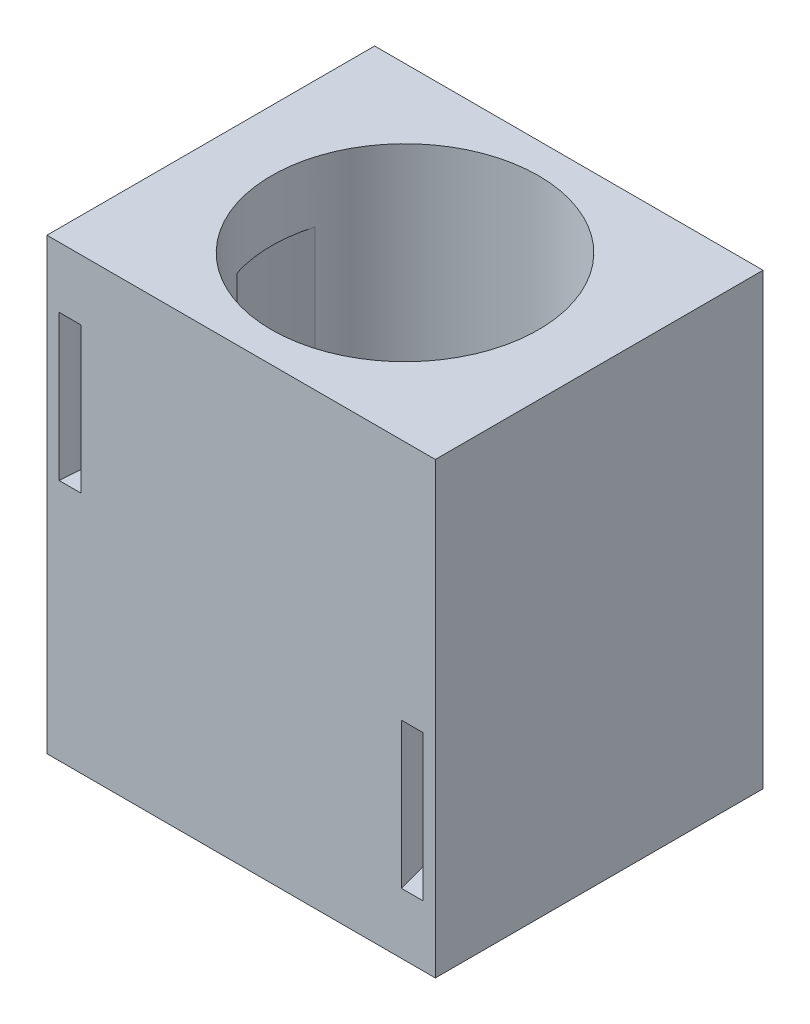
ISO-10303-21;
HEADER;
FILE_DESCRIPTION(('STEP AP214'),'2;1');
FILE_NAME('part.step','',(''),(''),'','','');
FILE_SCHEMA(('AUTOMOTIVE_DESIGN { 1 0 10303 214 1 1 1 1 }'));
ENDSEC;
DATA;
#1=APPLICATION_CONTEXT('core data for automotive mechanical design processes');
#2=APPLICATION_PROTOCOL_DEFINITION('international standard','automotive_design',2000,#1);
#3=PRODUCT_CONTEXT('',#1,'mechanical');
#4=PRODUCT('Part','Part','',(#3));
#5=PRODUCT_RELATED_PRODUCT_CATEGORY('part','',(#4));
#6=PRODUCT_DEFINITION_FORMATION('','',#4);
#7=PRODUCT_DEFINITION_CONTEXT('part definition',#1,'design');
#8=PRODUCT_DEFINITION('design','',#6,#7);
#9=PRODUCT_DEFINITION_SHAPE('','',#8);
#10=(LENGTH_UNIT() NAMED_UNIT(*) SI_UNIT(.MILLI.,.METRE.));
#11=(NAMED_UNIT(*) PLANE_ANGLE_UNIT() SI_UNIT($,.RADIAN.));
#12=(NAMED_UNIT(*) SI_UNIT($,.STERADIAN.) SOLID_ANGLE_UNIT());
#13=UNCERTAINTY_MEASURE_WITH_UNIT(LENGTH_MEASURE(1.E-05),#10,'distance_accuracy_value','');
#14=(GEOMETRIC_REPRESENTATION_CONTEXT(3) GLOBAL_UNCERTAINTY_ASSIGNED_CONTEXT((#13)) GLOBAL_UNIT_ASSIGNED_CONTEXT((#10,
#11,#12)) REPRESENTATION_CONTEXT('',''));
#15=CARTESIAN_POINT('',(0.,0.,0.));
#16=DIRECTION('',(0.,0.,1.));
#17=DIRECTION('',(1.,0.,0.));
#18=AXIS2_PLACEMENT_3D('',#15,#16,#17);
#19=CARTESIAN_POINT('',(16.,30.,13.5));
#20=DIRECTION('',(0.,0.,-1.));
#21=DIRECTION('',(-1.,0.,0.));
#22=AXIS2_PLACEMENT_3D('',#19,#20,#21);
#23=PLANE('',#22);
#24=DIRECTION('',(1.,0.,0.));
#25=VECTOR('',#24,1.);
#26=CARTESIAN_POINT('',(-15.,16.5,13.5));
#27=LINE('',#26,#25);
#28=CARTESIAN_POINT('',(-15.,16.5,13.5));
#29=VERTEX_POINT('',#28);
#30=CARTESIAN_POINT('',(-13.2,16.5,13.5));
#31=VERTEX_POINT('',#30);
#32=EDGE_CURVE('E193',#29,#31,#27,.T.);
#33=ORIENTED_EDGE('',*,*,#32,.F.);
#34=DIRECTION('',(0.,1.,0.));
#35=VECTOR('',#34,1.);
#36=CARTESIAN_POINT('',(-15.,16.5,13.5));
#37=LINE('',#36,#35);
#38=CARTESIAN_POINT('',(-15.,28.5,13.5));
#39=VERTEX_POINT('',#38);
#40=EDGE_CURVE('E200',#29,#39,#37,.T.);
#41=ORIENTED_EDGE('',*,*,#40,.T.);
#42=DIRECTION('',(1.,0.,0.));
#43=VECTOR('',#42,1.);
#44=CARTESIAN_POINT('',(-15.,28.5,13.5));
#45=LINE('',#44,#43);
#46=CARTESIAN_POINT('',(-13.2,28.5,13.5));
#47=VERTEX_POINT('',#46);
#48=EDGE_CURVE('E203',#39,#47,#45,.T.);
#49=ORIENTED_EDGE('',*,*,#48,.T.);
#50=DIRECTION('',(0.,1.,0.));
#51=VECTOR('',#50,1.);
#52=CARTESIAN_POINT('',(-13.2,16.5,13.5));
#53=LINE('',#52,#51);
#54=EDGE_CURVE('E211',#31,#47,#53,.T.);
#55=ORIENTED_EDGE('',*,*,#54,.F.);
#56=EDGE_LOOP('',(#33,#41,#49,#55));
#57=FACE_BOUND('',#56,.T.);
#58=DIRECTION('',(0.,-1.,0.));
#59=VECTOR('',#58,1.);
#60=CARTESIAN_POINT('',(-16.,30.,13.5));
#61=LINE('',#60,#59);
#62=CARTESIAN_POINT('',(-16.,33.5,13.5));
#63=VERTEX_POINT('',#62);
#64=CARTESIAN_POINT('',(-16.,-3.5,13.5));
#65=VERTEX_POINT('',#64);
#66=EDGE_CURVE('E123',#63,#65,#61,.T.);
#67=ORIENTED_EDGE('',*,*,#66,.T.);
#68=DIRECTION('',(-1.,0.,0.));
#69=VECTOR('',#68,1.);
#70=CARTESIAN_POINT('',(16.,-3.5,13.5));
#71=LINE('',#70,#69);
#72=CARTESIAN_POINT('',(16.,-3.5,13.5));
#73=VERTEX_POINT('',#72);
#74=EDGE_CURVE('E127',#73,#65,#71,.T.);
#75=ORIENTED_EDGE('',*,*,#74,.F.);
#76=DIRECTION('',(0.,-1.,0.));
#77=VECTOR('',#76,1.);
#78=CARTESIAN_POINT('',(16.,30.,13.5));
#79=LINE('',#78,#77);
#80=CARTESIAN_POINT('',(16.,33.5,13.5));
#81=VERTEX_POINT('',#80);
#82=EDGE_CURVE('E134',#81,#73,#79,.T.);
#83=ORIENTED_EDGE('',*,*,#82,.F.);
#84=DIRECTION('',(1.,0.,0.));
#85=VECTOR('',#84,1.);
#86=CARTESIAN_POINT('',(-16.,33.5,13.5));
#87=LINE('',#86,#85);
#88=EDGE_CURVE('E129',#63,#81,#87,.T.);
#89=ORIENTED_EDGE('',*,*,#88,.F.);
#90=EDGE_LOOP('',(#67,#75,#83,#89));
#91=FACE_BOUND('',#90,.T.);
#92=DIRECTION('',(-1.,0.,0.));
#93=VECTOR('',#92,1.);
#94=CARTESIAN_POINT('',(15.,13.5,13.5));
#95=LINE('',#94,#93);
#96=CARTESIAN_POINT('',(15.,13.5,13.5));
#97=VERTEX_POINT('',#96);
#98=CARTESIAN_POINT('',(13.2,13.5,13.5));
#99=VERTEX_POINT('',#98);
#100=EDGE_CURVE('E171',#97,#99,#95,.T.);
#101=ORIENTED_EDGE('',*,*,#100,.F.);
#102=DIRECTION('',(0.,-1.,0.));
#103=VECTOR('',#102,1.);
#104=CARTESIAN_POINT('',(15.,13.5,13.5));
#105=LINE('',#104,#103);
#106=CARTESIAN_POINT('',(15.,1.5,13.5));
#107=VERTEX_POINT('',#106);
#108=EDGE_CURVE('E177',#97,#107,#105,.T.);
#109=ORIENTED_EDGE('',*,*,#108,.T.);
#110=DIRECTION('',(-1.,0.,0.));
#111=VECTOR('',#110,1.);
#112=CARTESIAN_POINT('',(15.,1.5,13.5));
#113=LINE('',#112,#111);
#114=CARTESIAN_POINT('',(13.2,1.5,13.5));
#115=VERTEX_POINT('',#114);
#116=EDGE_CURVE('E179',#107,#115,#113,.T.);
#117=ORIENTED_EDGE('',*,*,#116,.T.);
#118=DIRECTION('',(0.,-1.,0.));
#119=VECTOR('',#118,1.);
#120=CARTESIAN_POINT('',(13.2,13.5,13.5));
#121=LINE('',#120,#119);
#122=EDGE_CURVE('E186',#99,#115,#121,.T.);
#123=ORIENTED_EDGE('',*,*,#122,.F.);
#124=EDGE_LOOP('',(#101,#109,#117,#123));
#125=FACE_BOUND('',#124,.T.);
#126=ADVANCED_FACE('F35',(#57,#91,#125),#23,.F.);
#127=CARTESIAN_POINT('',(0.,30.,0.));
#128=DIRECTION('',(0.,-1.,0.));
#129=DIRECTION('',(0.,0.,-1.));
#130=AXIS2_PLACEMENT_3D('',#127,#128,#129);
#131=CYLINDRICAL_SURFACE('',#130,11.);
#132=DIRECTION('',(0.,1.,0.));
#133=VECTOR('',#132,1.);
#134=CARTESIAN_POINT('',(-10.5410845469893,16.5,-3.14412731504676));
#135=LINE('',#134,#133);
#136=CARTESIAN_POINT('',(-10.5410845469893,16.5,-3.14412731504676));
#137=VERTEX_POINT('',#136);
#138=CARTESIAN_POINT('',(-10.5410845469893,28.5,-3.14412731504676));
#139=VERTEX_POINT('',#138);
#140=EDGE_CURVE('E208',#137,#139,#135,.T.);
#141=ORIENTED_EDGE('',*,*,#140,.F.);
#142=CARTESIAN_POINT('',(0.,16.5,0.));
#143=DIRECTION('',(0.,1.,0.));
#144=DIRECTION('',(0.,0.,1.));
#145=AXIS2_PLACEMENT_3D('',#142,#143,#144);
#146=CIRCLE('',#145,11.);
#147=CARTESIAN_POINT('',(-10.472424422504,16.5,3.36575797034525));
#148=VERTEX_POINT('',#147);
#149=EDGE_CURVE('E223',#137,#148,#146,.T.);
#150=ORIENTED_EDGE('',*,*,#149,.T.);
#151=DIRECTION('',(0.,-1.,0.));
#152=VECTOR('',#151,1.);
#153=CARTESIAN_POINT('',(-10.472424422504,30.,3.36575797034525));
#154=LINE('',#153,#152);
#155=CARTESIAN_POINT('',(-10.472424422504,28.5,3.36575797034525));
#156=VERTEX_POINT('',#155);
#157=EDGE_CURVE('E221',#156,#148,#154,.T.);
#158=ORIENTED_EDGE('',*,*,#157,.F.);
#159=CARTESIAN_POINT('',(0.,28.5,0.));
#160=DIRECTION('',(0.,1.,0.));
#161=DIRECTION('',(0.,0.,1.));
#162=AXIS2_PLACEMENT_3D('',#159,#160,#161);
#163=CIRCLE('',#162,11.);
#164=EDGE_CURVE('E133',#139,#156,#163,.T.);
#165=ORIENTED_EDGE('',*,*,#164,.F.);
#166=EDGE_LOOP('',(#141,#150,#158,#165));
#167=FACE_BOUND('',#166,.T.);
#168=DIRECTION('',(0.,-1.,0.));
#169=VECTOR('',#168,1.);
#170=CARTESIAN_POINT('',(10.5410845469893,13.5,-3.14412731504676));
#171=LINE('',#170,#169);
#172=CARTESIAN_POINT('',(10.5410845469893,13.5,-3.14412731504676));
#173=VERTEX_POINT('',#172);
#174=CARTESIAN_POINT('',(10.5410845469893,1.5,-3.14412731504676));
#175=VERTEX_POINT('',#174);
#176=EDGE_CURVE('E183',#173,#175,#171,.T.);
#177=ORIENTED_EDGE('',*,*,#176,.F.);
#178=CARTESIAN_POINT('',(0.,13.5,0.));
#179=DIRECTION('',(0.,-1.,0.));
#180=DIRECTION('',(0.,0.,-1.));
#181=AXIS2_PLACEMENT_3D('',#178,#179,#180);
#182=CIRCLE('',#181,11.);
#183=CARTESIAN_POINT('',(10.472424422504,13.5,3.36575797034525));
#184=VERTEX_POINT('',#183);
#185=EDGE_CURVE('E11',#173,#184,#182,.T.);
#186=ORIENTED_EDGE('',*,*,#185,.T.);
#187=DIRECTION('',(0.,-1.,0.));
#188=VECTOR('',#187,1.);
#189=CARTESIAN_POINT('',(10.472424422504,30.,3.36575797034525));
#190=LINE('',#189,#188);
#191=CARTESIAN_POINT('',(10.472424422504,1.5,3.36575797034525));
#192=VERTEX_POINT('',#191);
#193=EDGE_CURVE('E43',#192,#184,#190,.F.);
#194=ORIENTED_EDGE('',*,*,#193,.F.);
#195=CARTESIAN_POINT('',(0.,1.5,0.));
#196=DIRECTION('',(0.,-1.,0.));
#197=DIRECTION('',(0.,0.,-1.));
#198=AXIS2_PLACEMENT_3D('',#195,#196,#197);
#199=CIRCLE('',#198,11.);
#200=EDGE_CURVE('E226',#175,#192,#199,.T.);
#201=ORIENTED_EDGE('',*,*,#200,.F.);
#202=EDGE_LOOP('',(#177,#186,#194,#201));
#203=FACE_BOUND('',#202,.T.);
#204=CARTESIAN_POINT('',(0.,33.5,0.));
#205=DIRECTION('',(0.,1.,0.));
#206=DIRECTION('',(0.,0.,1.));
#207=AXIS2_PLACEMENT_3D('',#204,#205,#206);
#208=CIRCLE('',#207,11.);
#209=CARTESIAN_POINT('',(0.,33.5,11.));
#210=VERTEX_POINT('',#209);
#211=EDGE_CURVE('E156',#210,#210,#208,.T.);
#212=ORIENTED_EDGE('',*,*,#211,.T.);
#213=EDGE_LOOP('',(#212));
#214=FACE_BOUND('',#213,.T.);
#215=CARTESIAN_POINT('',(0.,-3.5,0.));
#216=DIRECTION('',(0.,-1.,0.));
#217=DIRECTION('',(0.,0.,-1.));
#218=AXIS2_PLACEMENT_3D('',#215,#216,#217);
#219=CIRCLE('',#218,11.);
#220=CARTESIAN_POINT('',(0.,-3.5,-11.));
#221=VERTEX_POINT('',#220);
#222=EDGE_CURVE('E149',#221,#221,#219,.T.);
#223=ORIENTED_EDGE('',*,*,#222,.T.);
#224=EDGE_LOOP('',(#223));
#225=FACE_BOUND('',#224,.T.);
#226=ADVANCED_FACE('F238',(#167,#203,#214,#225),#131,.F.);
#227=CARTESIAN_POINT('',(-16.,30.,-13.5));
#228=DIRECTION('',(1.,0.,0.));
#229=DIRECTION('',(0.,0.,-1.));
#230=AXIS2_PLACEMENT_3D('',#227,#228,#229);
#231=PLANE('',#230);
#232=DIRECTION('',(0.,-1.,0.));
#233=VECTOR('',#232,1.);
#234=CARTESIAN_POINT('',(-16.,30.,-13.5));
#235=LINE('',#234,#233);
#236=CARTESIAN_POINT('',(-16.,33.5,-13.5));
#237=VERTEX_POINT('',#236);
#238=CARTESIAN_POINT('',(-16.,-3.5,-13.5));
#239=VERTEX_POINT('',#238);
#240=EDGE_CURVE('E138',#237,#239,#235,.T.);
#241=ORIENTED_EDGE('',*,*,#240,.T.);
#242=DIRECTION('',(0.,0.,-1.));
#243=VECTOR('',#242,1.);
#244=CARTESIAN_POINT('',(-16.,-3.5,13.5));
#245=LINE('',#244,#243);
#246=EDGE_CURVE('E137',#65,#239,#245,.T.);
#247=ORIENTED_EDGE('',*,*,#246,.F.);
#248=ORIENTED_EDGE('',*,*,#66,.F.);
#249=DIRECTION('',(0.,0.,1.));
#250=VECTOR('',#249,1.);
#251=CARTESIAN_POINT('',(-16.,33.5,-13.5));
#252=LINE('',#251,#250);
#253=EDGE_CURVE('E162',#237,#63,#252,.T.);
#254=ORIENTED_EDGE('',*,*,#253,.F.);
#255=EDGE_LOOP('',(#241,#247,#248,#254));
#256=FACE_BOUND('',#255,.T.);
#257=ADVANCED_FACE('F37',(#256),#231,.F.);
#258=CARTESIAN_POINT('',(16.,30.,-13.5));
#259=DIRECTION('',(-1.,0.,0.));
#260=DIRECTION('',(0.,0.,1.));
#261=AXIS2_PLACEMENT_3D('',#258,#259,#260);
#262=PLANE('',#261);
#263=ORIENTED_EDGE('',*,*,#82,.T.);
#264=DIRECTION('',(0.,0.,1.));
#265=VECTOR('',#264,1.);
#266=CARTESIAN_POINT('',(16.,-3.5,-13.5));
#267=LINE('',#266,#265);
#268=CARTESIAN_POINT('',(16.,-3.5,-13.5));
#269=VERTEX_POINT('',#268);
#270=EDGE_CURVE('E148',#269,#73,#267,.T.);
#271=ORIENTED_EDGE('',*,*,#270,.F.);
#272=DIRECTION('',(0.,-1.,0.));
#273=VECTOR('',#272,1.);
#274=CARTESIAN_POINT('',(16.,30.,-13.5));
#275=LINE('',#274,#273);
#276=CARTESIAN_POINT('',(16.,33.5,-13.5));
#277=VERTEX_POINT('',#276);
#278=EDGE_CURVE('E217',#277,#269,#275,.T.);
#279=ORIENTED_EDGE('',*,*,#278,.F.);
#280=DIRECTION('',(0.,0.,-1.));
#281=VECTOR('',#280,1.);
#282=CARTESIAN_POINT('',(16.,33.5,13.5));
#283=LINE('',#282,#281);
#284=EDGE_CURVE('E165',#81,#277,#283,.T.);
#285=ORIENTED_EDGE('',*,*,#284,.F.);
#286=EDGE_LOOP('',(#263,#271,#279,#285));
#287=FACE_BOUND('',#286,.T.);
#288=ADVANCED_FACE('F263',(#287),#262,.F.);
#289=CARTESIAN_POINT('',(16.,30.,-13.5));
#290=DIRECTION('',(0.,0.,1.));
#291=DIRECTION('',(1.,0.,0.));
#292=AXIS2_PLACEMENT_3D('',#289,#290,#291);
#293=PLANE('',#292);
#294=ORIENTED_EDGE('',*,*,#278,.T.);
#295=DIRECTION('',(1.,0.,0.));
#296=VECTOR('',#295,1.);
#297=CARTESIAN_POINT('',(-16.,-3.5,-13.5));
#298=LINE('',#297,#296);
#299=EDGE_CURVE('E142',#239,#269,#298,.T.);
#300=ORIENTED_EDGE('',*,*,#299,.F.);
#301=ORIENTED_EDGE('',*,*,#240,.F.);
#302=DIRECTION('',(-1.,0.,0.));
#303=VECTOR('',#302,1.);
#304=CARTESIAN_POINT('',(16.,33.5,-13.5));
#305=LINE('',#304,#303);
#306=EDGE_CURVE('E159',#277,#237,#305,.T.);
#307=ORIENTED_EDGE('',*,*,#306,.F.);
#308=EDGE_LOOP('',(#294,#300,#301,#307));
#309=FACE_BOUND('',#308,.T.);
#310=ADVANCED_FACE('F266',(#309),#293,.F.);
#311=CARTESIAN_POINT('',(24.9601132838557,16.5,15.2858741113016));
#312=DIRECTION('',(0.,1.,0.));
#313=DIRECTION('',(0.,0.,1.));
#314=AXIS2_PLACEMENT_3D('',#311,#312,#313);
#315=CYLINDRICAL_SURFACE('',#314,40.);
#316=CARTESIAN_POINT('',(24.9601132838557,28.5,15.2858741113016));
#317=DIRECTION('',(0.,1.,0.));
#318=DIRECTION('',(0.,0.,1.));
#319=AXIS2_PLACEMENT_3D('',#316,#317,#318);
#320=CIRCLE('',#319,40.);
#321=EDGE_CURVE('E185',#139,#39,#320,.T.);
#322=ORIENTED_EDGE('',*,*,#321,.T.);
#323=ORIENTED_EDGE('',*,*,#40,.F.);
#324=CARTESIAN_POINT('',(24.9601132838557,16.5,15.2858741113016));
#325=DIRECTION('',(0.,1.,0.));
#326=DIRECTION('',(0.,0.,1.));
#327=AXIS2_PLACEMENT_3D('',#324,#325,#326);
#328=CIRCLE('',#327,40.);
#329=EDGE_CURVE('E190',#137,#29,#328,.T.);
#330=ORIENTED_EDGE('',*,*,#329,.F.);
#331=ORIENTED_EDGE('',*,*,#140,.T.);
#332=EDGE_LOOP('',(#322,#323,#330,#331));
#333=FACE_BOUND('',#332,.T.);
#334=ADVANCED_FACE('F269',(#333),#315,.F.);
#335=CARTESIAN_POINT('',(-13.2,16.5,13.5));
#336=DIRECTION('',(0.965636665998328,0.,0.259895804659548));
#337=DIRECTION('',(0.259895804659548,0.,-0.965636665998328));
#338=AXIS2_PLACEMENT_3D('',#335,#336,#337);
#339=PLANE('',#338);
#340=ORIENTED_EDGE('',*,*,#157,.T.);
#341=DIRECTION('',(0.259895804659548,0.,-0.965636665998328));
#342=VECTOR('',#341,1.);
#343=CARTESIAN_POINT('',(-13.2,16.5,13.5));
#344=LINE('',#343,#342);
#345=EDGE_CURVE('E197',#31,#148,#344,.T.);
#346=ORIENTED_EDGE('',*,*,#345,.F.);
#347=ORIENTED_EDGE('',*,*,#54,.T.);
#348=DIRECTION('',(0.259895804659548,0.,-0.965636665998328));
#349=VECTOR('',#348,1.);
#350=CARTESIAN_POINT('',(-13.2,28.5,13.5));
#351=LINE('',#350,#349);
#352=EDGE_CURVE('E194',#47,#156,#351,.T.);
#353=ORIENTED_EDGE('',*,*,#352,.T.);
#354=EDGE_LOOP('',(#340,#346,#347,#353));
#355=FACE_BOUND('',#354,.T.);
#356=ADVANCED_FACE('F274',(#355),#339,.F.);
#357=CARTESIAN_POINT('',(24.9601132838557,16.5,15.2858741113016));
#358=DIRECTION('',(0.,1.,0.));
#359=DIRECTION('',(0.,0.,1.));
#360=AXIS2_PLACEMENT_3D('',#357,#358,#359);
#361=PLANE('',#360);
#362=ORIENTED_EDGE('',*,*,#329,.T.);
#363=ORIENTED_EDGE('',*,*,#32,.T.);
#364=ORIENTED_EDGE('',*,*,#345,.T.);
#365=ORIENTED_EDGE('',*,*,#149,.F.);
#366=EDGE_LOOP('',(#362,#363,#364,#365));
#367=FACE_BOUND('',#366,.T.);
#368=ADVANCED_FACE('F278',(#367),#361,.T.);
#369=CARTESIAN_POINT('',(24.9601132838557,28.5,15.2858741113016));
#370=DIRECTION('',(0.,1.,0.));
#371=DIRECTION('',(0.,0.,1.));
#372=AXIS2_PLACEMENT_3D('',#369,#370,#371);
#373=PLANE('',#372);
#374=ORIENTED_EDGE('',*,*,#164,.T.);
#375=ORIENTED_EDGE('',*,*,#352,.F.);
#376=ORIENTED_EDGE('',*,*,#48,.F.);
#377=ORIENTED_EDGE('',*,*,#321,.F.);
#378=EDGE_LOOP('',(#374,#375,#376,#377));
#379=FACE_BOUND('',#378,.T.);
#380=ADVANCED_FACE('F280',(#379),#373,.F.);
#381=CARTESIAN_POINT('',(-24.9601132838557,13.5,15.2858741113016));
#382=DIRECTION('',(0.,-1.,0.));
#383=DIRECTION('',(0.,0.,-1.));
#384=AXIS2_PLACEMENT_3D('',#381,#382,#383);
#385=CYLINDRICAL_SURFACE('',#384,40.);
#386=CARTESIAN_POINT('',(-24.9601132838557,1.5,15.2858741113016));
#387=DIRECTION('',(0.,-1.,0.));
#388=DIRECTION('',(0.,0.,1.));
#389=AXIS2_PLACEMENT_3D('',#386,#387,#388);
#390=CIRCLE('',#389,40.);
#391=EDGE_CURVE('E55',#175,#107,#390,.T.);
#392=ORIENTED_EDGE('',*,*,#391,.T.);
#393=ORIENTED_EDGE('',*,*,#108,.F.);
#394=CARTESIAN_POINT('',(-24.9601132838557,13.5,15.2858741113016));
#395=DIRECTION('',(0.,-1.,0.));
#396=DIRECTION('',(0.,0.,1.));
#397=AXIS2_PLACEMENT_3D('',#394,#395,#396);
#398=CIRCLE('',#397,40.);
#399=EDGE_CURVE('E168',#173,#97,#398,.T.);
#400=ORIENTED_EDGE('',*,*,#399,.F.);
#401=ORIENTED_EDGE('',*,*,#176,.T.);
#402=EDGE_LOOP('',(#392,#393,#400,#401));
#403=FACE_BOUND('',#402,.T.);
#404=ADVANCED_FACE('F241',(#403),#385,.F.);
#405=CARTESIAN_POINT('',(13.2,13.5,13.5));
#406=DIRECTION('',(-0.965636665998328,0.,0.259895804659549));
#407=DIRECTION('',(0.259895804659549,0.,0.965636665998328));
#408=AXIS2_PLACEMENT_3D('',#405,#406,#407);
#409=PLANE('',#408);
#410=ORIENTED_EDGE('',*,*,#193,.T.);
#411=DIRECTION('',(-0.259895804659549,0.,-0.965636665998328));
#412=VECTOR('',#411,1.);
#413=CARTESIAN_POINT('',(13.2,13.5,13.5));
#414=LINE('',#413,#412);
#415=EDGE_CURVE('E174',#99,#184,#414,.T.);
#416=ORIENTED_EDGE('',*,*,#415,.F.);
#417=ORIENTED_EDGE('',*,*,#122,.T.);
#418=DIRECTION('',(-0.259895804659549,0.,-0.965636665998328));
#419=VECTOR('',#418,1.);
#420=CARTESIAN_POINT('',(13.2,1.5,13.5));
#421=LINE('',#420,#419);
#422=EDGE_CURVE('E50',#115,#192,#421,.T.);
#423=ORIENTED_EDGE('',*,*,#422,.T.);
#424=EDGE_LOOP('',(#410,#416,#417,#423));
#425=FACE_BOUND('',#424,.T.);
#426=ADVANCED_FACE('F229',(#425),#409,.F.);
#427=CARTESIAN_POINT('',(-24.9601132838557,13.5,15.2858741113016));
#428=DIRECTION('',(0.,-1.,0.));
#429=DIRECTION('',(0.,0.,1.));
#430=AXIS2_PLACEMENT_3D('',#427,#428,#429);
#431=PLANE('',#430);
#432=ORIENTED_EDGE('',*,*,#399,.T.);
#433=ORIENTED_EDGE('',*,*,#100,.T.);
#434=ORIENTED_EDGE('',*,*,#415,.T.);
#435=ORIENTED_EDGE('',*,*,#185,.F.);
#436=EDGE_LOOP('',(#432,#433,#434,#435));
#437=FACE_BOUND('',#436,.T.);
#438=ADVANCED_FACE('F233',(#437),#431,.T.);
#439=CARTESIAN_POINT('',(-24.9601132838557,1.5,15.2858741113016));
#440=DIRECTION('',(0.,-1.,0.));
#441=DIRECTION('',(0.,0.,1.));
#442=AXIS2_PLACEMENT_3D('',#439,#440,#441);
#443=PLANE('',#442);
#444=ORIENTED_EDGE('',*,*,#200,.T.);
#445=ORIENTED_EDGE('',*,*,#422,.F.);
#446=ORIENTED_EDGE('',*,*,#116,.F.);
#447=ORIENTED_EDGE('',*,*,#391,.F.);
#448=EDGE_LOOP('',(#444,#445,#446,#447));
#449=FACE_BOUND('',#448,.T.);
#450=ADVANCED_FACE('F242',(#449),#443,.F.);
#451=CARTESIAN_POINT('',(0.,33.5,0.));
#452=DIRECTION('',(0.,1.,0.));
#453=DIRECTION('',(0.,0.,1.));
#454=AXIS2_PLACEMENT_3D('',#451,#452,#453);
#455=PLANE('',#454);
#456=ORIENTED_EDGE('',*,*,#306,.T.);
#457=ORIENTED_EDGE('',*,*,#253,.T.);
#458=ORIENTED_EDGE('',*,*,#88,.T.);
#459=ORIENTED_EDGE('',*,*,#284,.T.);
#460=EDGE_LOOP('',(#456,#457,#458,#459));
#461=FACE_BOUND('',#460,.T.);
#462=ORIENTED_EDGE('',*,*,#211,.F.);
#463=EDGE_LOOP('',(#462));
#464=FACE_BOUND('',#463,.T.);
#465=ADVANCED_FACE('F244',(#461,#464),#455,.T.);
#466=CARTESIAN_POINT('',(0.,-3.5,0.));
#467=DIRECTION('',(0.,-1.,0.));
#468=DIRECTION('',(0.,0.,-1.));
#469=AXIS2_PLACEMENT_3D('',#466,#467,#468);
#470=PLANE('',#469);
#471=ORIENTED_EDGE('',*,*,#74,.T.);
#472=ORIENTED_EDGE('',*,*,#246,.T.);
#473=ORIENTED_EDGE('',*,*,#299,.T.);
#474=ORIENTED_EDGE('',*,*,#270,.T.);
#475=EDGE_LOOP('',(#471,#472,#473,#474));
#476=FACE_BOUND('',#475,.T.);
#477=ORIENTED_EDGE('',*,*,#222,.F.);
#478=EDGE_LOOP('',(#477));
#479=FACE_BOUND('',#478,.T.);
#480=ADVANCED_FACE('F145',(#476,#479),#470,.T.);
#481=CLOSED_SHELL('',(#126,#226,#257,#288,#310,#334,#356,#368,#380,#404,#426,#438,#450,#465,#480));
#482=MANIFOLD_SOLID_BREP('B2',#481);
#483=ADVANCED_BREP_SHAPE_REPRESENTATION('',(#18,#482),#14);
#484=SHAPE_DEFINITION_REPRESENTATION(#9,#483);
ENDSEC;
END-ISO-10303-21;
